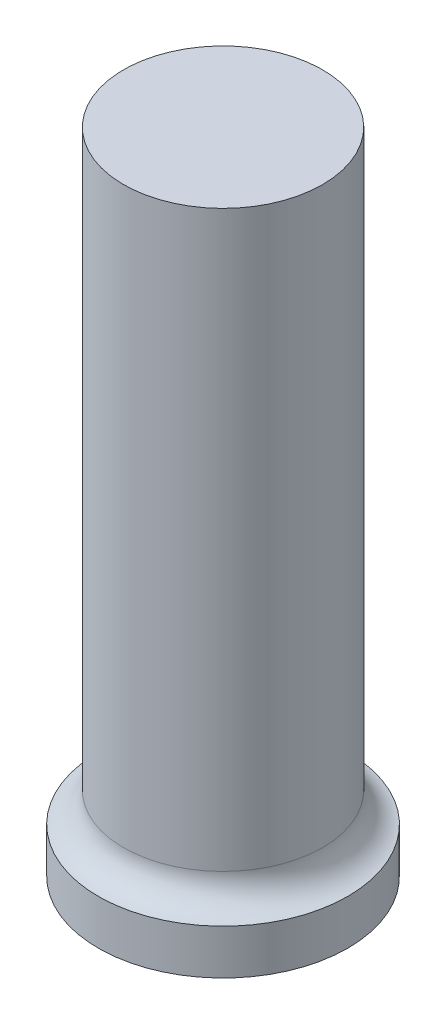
ISO-10303-21;
HEADER;
FILE_DESCRIPTION(('STEP AP214'),'2;1');
FILE_NAME('part.step','',(''),(''),'','','');
FILE_SCHEMA(('AUTOMOTIVE_DESIGN { 1 0 10303 214 1 1 1 1 }'));
ENDSEC;
DATA;
#1=APPLICATION_CONTEXT('core data for automotive mechanical design processes');
#2=APPLICATION_PROTOCOL_DEFINITION('international standard','automotive_design',2000,#1);
#3=PRODUCT_CONTEXT('',#1,'mechanical');
#4=PRODUCT('Part','Part','',(#3));
#5=PRODUCT_RELATED_PRODUCT_CATEGORY('part','',(#4));
#6=PRODUCT_DEFINITION_FORMATION('','',#4);
#7=PRODUCT_DEFINITION_CONTEXT('part definition',#1,'design');
#8=PRODUCT_DEFINITION('design','',#6,#7);
#9=PRODUCT_DEFINITION_SHAPE('','',#8);
#10=(LENGTH_UNIT() NAMED_UNIT(*) SI_UNIT(.MILLI.,.METRE.));
#11=(NAMED_UNIT(*) PLANE_ANGLE_UNIT() SI_UNIT($,.RADIAN.));
#12=(NAMED_UNIT(*) SI_UNIT($,.STERADIAN.) SOLID_ANGLE_UNIT());
#13=UNCERTAINTY_MEASURE_WITH_UNIT(LENGTH_MEASURE(1.E-05),#10,'distance_accuracy_value','');
#14=(GEOMETRIC_REPRESENTATION_CONTEXT(3) GLOBAL_UNCERTAINTY_ASSIGNED_CONTEXT((#13)) GLOBAL_UNIT_ASSIGNED_CONTEXT((#10,
#11,#12)) REPRESENTATION_CONTEXT('',''));
#15=CARTESIAN_POINT('',(0.,0.,0.));
#16=DIRECTION('',(0.,0.,1.));
#17=DIRECTION('',(1.,0.,0.));
#18=AXIS2_PLACEMENT_3D('',#15,#16,#17);
#19=CARTESIAN_POINT('',(0.3175,-0.6096,0.));
#20=DIRECTION('',(0.,-1.,0.));
#21=DIRECTION('',(1.,0.,0.));
#22=AXIS2_PLACEMENT_3D('',#19,#20,#21);
#23=PLANE('',#22);
#24=CARTESIAN_POINT('',(0.,-0.6096,0.));
#25=DIRECTION('',(0.,-1.,0.));
#26=DIRECTION('',(1.,0.,0.));
#27=AXIS2_PLACEMENT_3D('',#24,#25,#26);
#28=CIRCLE('',#27,0.3175);
#29=CARTESIAN_POINT('',(0.3175,-0.6096,0.));
#30=VERTEX_POINT('',#29);
#31=EDGE_CURVE('E18',#30,#30,#28,.F.);
#32=ORIENTED_EDGE('',*,*,#31,.F.);
#33=EDGE_LOOP('',(#32));
#34=FACE_BOUND('',#33,.T.);
#35=ADVANCED_FACE('F15',(#34),#23,.T.);
#36=CARTESIAN_POINT('',(0.,0.,0.));
#37=DIRECTION('',(0.,-1.,0.));
#38=DIRECTION('',(1.,0.,0.));
#39=AXIS2_PLACEMENT_3D('',#36,#37,#38);
#40=CYLINDRICAL_SURFACE('',#39,0.3175);
#41=CARTESIAN_POINT('',(0.,0.,0.));
#42=DIRECTION('',(0.,-1.,0.));
#43=DIRECTION('',(1.,0.,0.));
#44=AXIS2_PLACEMENT_3D('',#41,#42,#43);
#45=CIRCLE('',#44,0.3175);
#46=CARTESIAN_POINT('',(0.3175,0.,0.));
#47=VERTEX_POINT('',#46);
#48=EDGE_CURVE('E117',#47,#47,#45,.F.);
#49=ORIENTED_EDGE('',*,*,#48,.F.);
#50=EDGE_LOOP('',(#49));
#51=FACE_BOUND('',#50,.T.);
#52=ORIENTED_EDGE('',*,*,#31,.T.);
#53=EDGE_LOOP('',(#52));
#54=FACE_BOUND('',#53,.T.);
#55=ADVANCED_FACE('F50',(#51,#54),#40,.T.);
#56=CARTESIAN_POINT('',(0.3175,0.,0.));
#57=DIRECTION('',(0.,-1.,0.));
#58=DIRECTION('',(1.,0.,0.));
#59=AXIS2_PLACEMENT_3D('',#56,#57,#58);
#60=PLANE('',#59);
#61=ORIENTED_EDGE('',*,*,#48,.T.);
#62=EDGE_LOOP('',(#61));
#63=FACE_BOUND('',#62,.T.);
#64=CARTESIAN_POINT('',(0.,0.,0.));
#65=DIRECTION('',(0.,-1.,0.));
#66=DIRECTION('',(1.,0.,0.));
#67=AXIS2_PLACEMENT_3D('',#64,#65,#66);
#68=CIRCLE('',#67,2.5);
#69=CARTESIAN_POINT('',(2.5,0.,0.));
#70=VERTEX_POINT('',#69);
#71=EDGE_CURVE('E120',#70,#70,#68,.F.);
#72=ORIENTED_EDGE('',*,*,#71,.F.);
#73=EDGE_LOOP('',(#72));
#74=FACE_BOUND('',#73,.T.);
#75=ADVANCED_FACE('F47',(#63,#74),#60,.T.);
#76=CARTESIAN_POINT('',(0.,0.,0.));
#77=DIRECTION('',(0.,-1.,0.));
#78=DIRECTION('',(1.,0.,0.));
#79=AXIS2_PLACEMENT_3D('',#76,#77,#78);
#80=CYLINDRICAL_SURFACE('',#79,2.5);
#81=ORIENTED_EDGE('',*,*,#71,.T.);
#82=EDGE_LOOP('',(#81));
#83=FACE_BOUND('',#82,.T.);
#84=CARTESIAN_POINT('',(0.,0.9,0.));
#85=DIRECTION('',(0.,-1.,0.));
#86=DIRECTION('',(1.,0.,0.));
#87=AXIS2_PLACEMENT_3D('',#84,#85,#86);
#88=CIRCLE('',#87,2.5);
#89=CARTESIAN_POINT('',(2.5,0.9,0.));
#90=VERTEX_POINT('',#89);
#91=EDGE_CURVE('E27',#90,#90,#88,.T.);
#92=ORIENTED_EDGE('',*,*,#91,.T.);
#93=EDGE_LOOP('',(#92));
#94=FACE_BOUND('',#93,.T.);
#95=ADVANCED_FACE('F43',(#83,#94),#80,.T.);
#96=CARTESIAN_POINT('',(1.9939,13.,0.));
#97=DIRECTION('',(0.,1.,0.));
#98=DIRECTION('',(-1.,0.,0.));
#99=AXIS2_PLACEMENT_3D('',#96,#97,#98);
#100=PLANE('',#99);
#101=CARTESIAN_POINT('',(0.,13.,0.));
#102=DIRECTION('',(0.,-1.,0.));
#103=DIRECTION('',(1.,0.,0.));
#104=AXIS2_PLACEMENT_3D('',#101,#102,#103);
#105=CIRCLE('',#104,1.9939);
#106=CARTESIAN_POINT('',(1.9939,13.,0.));
#107=VERTEX_POINT('',#106);
#108=EDGE_CURVE('E22',#107,#107,#105,.T.);
#109=ORIENTED_EDGE('',*,*,#108,.F.);
#110=EDGE_LOOP('',(#109));
#111=FACE_BOUND('',#110,.T.);
#112=ADVANCED_FACE('F39',(#111),#100,.T.);
#113=CARTESIAN_POINT('',(0.,1.49260677518908,0.));
#114=DIRECTION('',(0.,-1.,0.));
#115=DIRECTION('',(1.,0.,0.));
#116=AXIS2_PLACEMENT_3D('',#113,#114,#115);
#117=TOROIDAL_SURFACE('',#116,2.5939,0.6);
#118=ORIENTED_EDGE('',*,*,#91,.F.);
#119=EDGE_LOOP('',(#118));
#120=FACE_BOUND('',#119,.T.);
#121=CARTESIAN_POINT('',(0.,1.49260677518908,0.));
#122=DIRECTION('',(0.,-1.,0.));
#123=DIRECTION('',(1.,0.,0.));
#124=AXIS2_PLACEMENT_3D('',#121,#122,#123);
#125=CIRCLE('',#124,1.9939);
#126=CARTESIAN_POINT('',(1.9939,1.49260677518908,0.));
#127=VERTEX_POINT('',#126);
#128=EDGE_CURVE('E10',#127,#127,#125,.F.);
#129=ORIENTED_EDGE('',*,*,#128,.F.);
#130=EDGE_LOOP('',(#129));
#131=FACE_BOUND('',#130,.T.);
#132=ADVANCED_FACE('F34',(#120,#131),#117,.F.);
#133=CARTESIAN_POINT('',(0.,0.,0.));
#134=DIRECTION('',(0.,-1.,0.));
#135=DIRECTION('',(1.,0.,0.));
#136=AXIS2_PLACEMENT_3D('',#133,#134,#135);
#137=CYLINDRICAL_SURFACE('',#136,1.9939);
#138=ORIENTED_EDGE('',*,*,#128,.T.);
#139=EDGE_LOOP('',(#138));
#140=FACE_BOUND('',#139,.T.);
#141=ORIENTED_EDGE('',*,*,#108,.T.);
#142=EDGE_LOOP('',(#141));
#143=FACE_BOUND('',#142,.T.);
#144=ADVANCED_FACE('F38',(#140,#143),#137,.T.);
#145=CLOSED_SHELL('',(#35,#55,#75,#95,#112,#132,#144));
#146=MANIFOLD_SOLID_BREP('B1',#145);
#147=ADVANCED_BREP_SHAPE_REPRESENTATION('',(#18,#146),#14);
#148=SHAPE_DEFINITION_REPRESENTATION(#9,#147);
ENDSEC;
END-ISO-10303-21;
